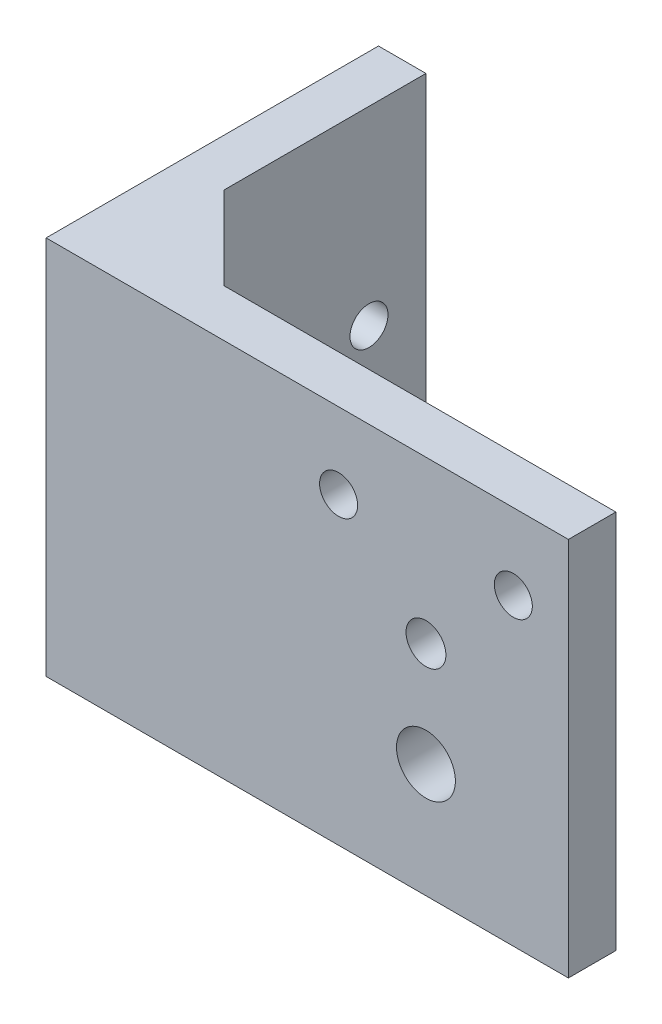
ISO-10303-21;
HEADER;
FILE_DESCRIPTION(('STEP AP214'),'2;1');
FILE_NAME('part.step','',(''),(''),'','','');
FILE_SCHEMA(('AUTOMOTIVE_DESIGN { 1 0 10303 214 1 1 1 1 }'));
ENDSEC;
DATA;
#1=APPLICATION_CONTEXT('core data for automotive mechanical design processes');
#2=APPLICATION_PROTOCOL_DEFINITION('international standard','automotive_design',2000,#1);
#3=PRODUCT_CONTEXT('',#1,'mechanical');
#4=PRODUCT('Part','Part','',(#3));
#5=PRODUCT_RELATED_PRODUCT_CATEGORY('part','',(#4));
#6=PRODUCT_DEFINITION_FORMATION('','',#4);
#7=PRODUCT_DEFINITION_CONTEXT('part definition',#1,'design');
#8=PRODUCT_DEFINITION('design','',#6,#7);
#9=PRODUCT_DEFINITION_SHAPE('','',#8);
#10=(LENGTH_UNIT() NAMED_UNIT(*) SI_UNIT(.MILLI.,.METRE.));
#11=(NAMED_UNIT(*) PLANE_ANGLE_UNIT() SI_UNIT($,.RADIAN.));
#12=(NAMED_UNIT(*) SI_UNIT($,.STERADIAN.) SOLID_ANGLE_UNIT());
#13=UNCERTAINTY_MEASURE_WITH_UNIT(LENGTH_MEASURE(1.E-05),#10,'distance_accuracy_value','');
#14=(GEOMETRIC_REPRESENTATION_CONTEXT(3) GLOBAL_UNCERTAINTY_ASSIGNED_CONTEXT((#13)) GLOBAL_UNIT_ASSIGNED_CONTEXT((#10,
#11,#12)) REPRESENTATION_CONTEXT('',''));
#15=CARTESIAN_POINT('',(0.,0.,0.));
#16=DIRECTION('',(0.,0.,1.));
#17=DIRECTION('',(1.,0.,0.));
#18=AXIS2_PLACEMENT_3D('',#15,#16,#17);
#19=CARTESIAN_POINT('',(5.,40.,-35.));
#20=DIRECTION('',(1.,0.,0.));
#21=DIRECTION('',(0.,0.,-1.));
#22=AXIS2_PLACEMENT_3D('',#19,#20,#21);
#23=PLANE('',#22);
#24=CARTESIAN_POINT('',(5.,31.,-11.));
#25=DIRECTION('',(1.,0.,0.));
#26=DIRECTION('',(0.,0.,-1.));
#27=AXIS2_PLACEMENT_3D('',#24,#25,#26);
#28=CIRCLE('',#27,2.);
#29=CARTESIAN_POINT('',(5.,31.,-13.));
#30=VERTEX_POINT('',#29);
#31=EDGE_CURVE('E481',#30,#30,#28,.T.);
#32=ORIENTED_EDGE('',*,*,#31,.F.);
#33=EDGE_LOOP('',(#32));
#34=FACE_BOUND('',#33,.T.);
#35=CARTESIAN_POINT('',(5.,8.99999999999999,-11.));
#36=DIRECTION('',(1.,0.,0.));
#37=DIRECTION('',(0.,0.,-1.));
#38=AXIS2_PLACEMENT_3D('',#35,#36,#37);
#39=CIRCLE('',#38,2.);
#40=CARTESIAN_POINT('',(5.,8.99999999999999,-13.));
#41=VERTEX_POINT('',#40);
#42=EDGE_CURVE('E473',#41,#41,#39,.T.);
#43=ORIENTED_EDGE('',*,*,#42,.F.);
#44=EDGE_LOOP('',(#43));
#45=FACE_BOUND('',#44,.T.);
#46=CARTESIAN_POINT('',(5.,20.,-29.));
#47=DIRECTION('',(1.,0.,0.));
#48=DIRECTION('',(0.,0.,-1.));
#49=AXIS2_PLACEMENT_3D('',#46,#47,#48);
#50=CIRCLE('',#49,2.);
#51=CARTESIAN_POINT('',(5.,20.,-31.));
#52=VERTEX_POINT('',#51);
#53=EDGE_CURVE('E465',#52,#52,#50,.T.);
#54=ORIENTED_EDGE('',*,*,#53,.F.);
#55=EDGE_LOOP('',(#54));
#56=FACE_BOUND('',#55,.T.);
#57=DIRECTION('',(0.,0.,1.));
#58=VECTOR('',#57,1.);
#59=CARTESIAN_POINT('',(5.,5.,-13.7500000000001));
#60=LINE('',#59,#58);
#61=CARTESIAN_POINT('',(5.,5.,-13.7500000000001));
#62=VERTEX_POINT('',#61);
#63=CARTESIAN_POINT('',(5.,5.,-5.));
#64=VERTEX_POINT('',#63);
#65=EDGE_CURVE('E195',#62,#64,#60,.T.);
#66=ORIENTED_EDGE('',*,*,#65,.F.);
#67=DIRECTION('',(0.,-1.,0.));
#68=VECTOR('',#67,1.);
#69=CARTESIAN_POINT('',(5.,5.,-13.7500000000001));
#70=LINE('',#69,#68);
#71=CARTESIAN_POINT('',(5.,0.,-13.7500000000001));
#72=VERTEX_POINT('',#71);
#73=EDGE_CURVE('E424',#62,#72,#70,.T.);
#74=ORIENTED_EDGE('',*,*,#73,.T.);
#75=DIRECTION('',(0.,0.,1.));
#76=VECTOR('',#75,1.);
#77=CARTESIAN_POINT('',(5.,0.,-35.));
#78=LINE('',#77,#76);
#79=CARTESIAN_POINT('',(5.,0.,-35.));
#80=VERTEX_POINT('',#79);
#81=EDGE_CURVE('E157',#80,#72,#78,.T.);
#82=ORIENTED_EDGE('',*,*,#81,.F.);
#83=DIRECTION('',(0.,-1.,0.));
#84=VECTOR('',#83,1.);
#85=CARTESIAN_POINT('',(5.,40.,-35.));
#86=LINE('',#85,#84);
#87=CARTESIAN_POINT('',(5.,40.,-35.));
#88=VERTEX_POINT('',#87);
#89=EDGE_CURVE('E49',#88,#80,#86,.T.);
#90=ORIENTED_EDGE('',*,*,#89,.F.);
#91=DIRECTION('',(0.,0.,1.));
#92=VECTOR('',#91,1.);
#93=CARTESIAN_POINT('',(5.,40.,-35.));
#94=LINE('',#93,#92);
#95=CARTESIAN_POINT('',(5.,40.,-13.7500000000001));
#96=VERTEX_POINT('',#95);
#97=EDGE_CURVE('E116',#88,#96,#94,.T.);
#98=ORIENTED_EDGE('',*,*,#97,.T.);
#99=DIRECTION('',(0.,-1.,0.));
#100=VECTOR('',#99,1.);
#101=CARTESIAN_POINT('',(5.,40.,-13.7500000000001));
#102=LINE('',#101,#100);
#103=CARTESIAN_POINT('',(5.,35.,-13.7500000000001));
#104=VERTEX_POINT('',#103);
#105=EDGE_CURVE('E11',#96,#104,#102,.T.);
#106=ORIENTED_EDGE('',*,*,#105,.T.);
#107=DIRECTION('',(0.,0.,1.));
#108=VECTOR('',#107,1.);
#109=CARTESIAN_POINT('',(5.,35.,-13.7500000000001));
#110=LINE('',#109,#108);
#111=CARTESIAN_POINT('',(5.,35.,-5.));
#112=VERTEX_POINT('',#111);
#113=EDGE_CURVE('E214',#104,#112,#110,.T.);
#114=ORIENTED_EDGE('',*,*,#113,.T.);
#115=DIRECTION('',(0.,-1.,0.));
#116=VECTOR('',#115,1.);
#117=CARTESIAN_POINT('',(5.,35.,-5.));
#118=LINE('',#117,#116);
#119=EDGE_CURVE('E145',#112,#64,#118,.T.);
#120=ORIENTED_EDGE('',*,*,#119,.T.);
#121=EDGE_LOOP('',(#66,#74,#82,#90,#98,#106,#114,#120));
#122=FACE_BOUND('',#121,.T.);
#123=ADVANCED_FACE('F39',(#34,#45,#56,#122),#23,.T.);
#124=CARTESIAN_POINT('',(13.75,40.,-5.));
#125=DIRECTION('',(0.,0.,-1.));
#126=DIRECTION('',(-1.,0.,0.));
#127=AXIS2_PLACEMENT_3D('',#124,#125,#126);
#128=PLANE('',#127);
#129=CARTESIAN_POINT('',(49.2,32.,-5.));
#130=DIRECTION('',(0.,0.,-1.));
#131=DIRECTION('',(-1.,0.,0.));
#132=AXIS2_PLACEMENT_3D('',#129,#130,#131);
#133=CIRCLE('',#132,2.);
#134=CARTESIAN_POINT('',(47.2,32.,-5.));
#135=VERTEX_POINT('',#134);
#136=EDGE_CURVE('E459',#135,#135,#133,.T.);
#137=ORIENTED_EDGE('',*,*,#136,.F.);
#138=EDGE_LOOP('',(#137));
#139=FACE_BOUND('',#138,.T.);
#140=CARTESIAN_POINT('',(40.,12.,-5.));
#141=DIRECTION('',(0.,0.,-1.));
#142=DIRECTION('',(-1.,0.,0.));
#143=AXIS2_PLACEMENT_3D('',#140,#141,#142);
#144=CIRCLE('',#143,3.1);
#145=CARTESIAN_POINT('',(36.9,12.,-5.));
#146=VERTEX_POINT('',#145);
#147=EDGE_CURVE('E451',#146,#146,#144,.T.);
#148=ORIENTED_EDGE('',*,*,#147,.F.);
#149=EDGE_LOOP('',(#148));
#150=FACE_BOUND('',#149,.T.);
#151=CARTESIAN_POINT('',(40.,23.,-5.));
#152=DIRECTION('',(0.,0.,-1.));
#153=DIRECTION('',(-1.,0.,0.));
#154=AXIS2_PLACEMENT_3D('',#151,#152,#153);
#155=CIRCLE('',#154,2.1);
#156=CARTESIAN_POINT('',(37.9,23.,-5.));
#157=VERTEX_POINT('',#156);
#158=EDGE_CURVE('E443',#157,#157,#155,.T.);
#159=ORIENTED_EDGE('',*,*,#158,.F.);
#160=EDGE_LOOP('',(#159));
#161=FACE_BOUND('',#160,.T.);
#162=CARTESIAN_POINT('',(30.8,32.,-5.));
#163=DIRECTION('',(0.,0.,-1.));
#164=DIRECTION('',(-1.,0.,0.));
#165=AXIS2_PLACEMENT_3D('',#162,#163,#164);
#166=CIRCLE('',#165,2.);
#167=CARTESIAN_POINT('',(28.8,32.,-5.));
#168=VERTEX_POINT('',#167);
#169=EDGE_CURVE('E434',#168,#168,#166,.T.);
#170=ORIENTED_EDGE('',*,*,#169,.F.);
#171=EDGE_LOOP('',(#170));
#172=FACE_BOUND('',#171,.T.);
#173=DIRECTION('',(1.,0.,0.));
#174=VECTOR('',#173,1.);
#175=CARTESIAN_POINT('',(13.75,0.,-5.));
#176=LINE('',#175,#174);
#177=CARTESIAN_POINT('',(13.75,0.,-5.));
#178=VERTEX_POINT('',#177);
#179=CARTESIAN_POINT('',(55.,0.,-5.));
#180=VERTEX_POINT('',#179);
#181=EDGE_CURVE('E141',#178,#180,#176,.T.);
#182=ORIENTED_EDGE('',*,*,#181,.F.);
#183=DIRECTION('',(0.,-1.,0.));
#184=VECTOR('',#183,1.);
#185=CARTESIAN_POINT('',(13.75,5.,-5.));
#186=LINE('',#185,#184);
#187=CARTESIAN_POINT('',(13.75,5.,-5.));
#188=VERTEX_POINT('',#187);
#189=EDGE_CURVE('E210',#188,#178,#186,.T.);
#190=ORIENTED_EDGE('',*,*,#189,.F.);
#191=DIRECTION('',(1.,0.,0.));
#192=VECTOR('',#191,1.);
#193=CARTESIAN_POINT('',(5.,5.,-5.));
#194=LINE('',#193,#192);
#195=EDGE_CURVE('E198',#64,#188,#194,.T.);
#196=ORIENTED_EDGE('',*,*,#195,.F.);
#197=ORIENTED_EDGE('',*,*,#119,.F.);
#198=DIRECTION('',(1.,0.,0.));
#199=VECTOR('',#198,1.);
#200=CARTESIAN_POINT('',(5.,35.,-5.));
#201=LINE('',#200,#199);
#202=CARTESIAN_POINT('',(13.75,35.,-5.));
#203=VERTEX_POINT('',#202);
#204=EDGE_CURVE('E419',#112,#203,#201,.T.);
#205=ORIENTED_EDGE('',*,*,#204,.T.);
#206=DIRECTION('',(0.,-1.,0.));
#207=VECTOR('',#206,1.);
#208=CARTESIAN_POINT('',(13.75,40.,-5.));
#209=LINE('',#208,#207);
#210=CARTESIAN_POINT('',(13.75,40.,-5.));
#211=VERTEX_POINT('',#210);
#212=EDGE_CURVE('E43',#211,#203,#209,.T.);
#213=ORIENTED_EDGE('',*,*,#212,.F.);
#214=DIRECTION('',(1.,0.,0.));
#215=VECTOR('',#214,1.);
#216=CARTESIAN_POINT('',(13.75,40.,-5.));
#217=LINE('',#216,#215);
#218=CARTESIAN_POINT('',(55.,40.,-5.));
#219=VERTEX_POINT('',#218);
#220=EDGE_CURVE('E223',#211,#219,#217,.T.);
#221=ORIENTED_EDGE('',*,*,#220,.T.);
#222=DIRECTION('',(0.,-1.,0.));
#223=VECTOR('',#222,1.);
#224=CARTESIAN_POINT('',(55.,40.,-5.));
#225=LINE('',#224,#223);
#226=EDGE_CURVE('E168',#219,#180,#225,.T.);
#227=ORIENTED_EDGE('',*,*,#226,.T.);
#228=EDGE_LOOP('',(#182,#190,#196,#197,#205,#213,#221,#227));
#229=FACE_BOUND('',#228,.T.);
#230=ADVANCED_FACE('F209',(#139,#150,#161,#172,#229),#128,.T.);
#231=CARTESIAN_POINT('',(5.,40.,-13.7500000000001));
#232=DIRECTION('',(0.707106781186553,0.,-0.707106781186542));
#233=DIRECTION('',(-0.707106781186542,0.,-0.707106781186553));
#234=AXIS2_PLACEMENT_3D('',#231,#232,#233);
#235=PLANE('',#234);
#236=ORIENTED_EDGE('',*,*,#212,.T.);
#237=DIRECTION('',(-0.707106781186542,0.,-0.707106781186553));
#238=VECTOR('',#237,1.);
#239=CARTESIAN_POINT('',(13.75,35.,-5.));
#240=LINE('',#239,#238);
#241=EDGE_CURVE('E177',#203,#104,#240,.T.);
#242=ORIENTED_EDGE('',*,*,#241,.T.);
#243=ORIENTED_EDGE('',*,*,#105,.F.);
#244=DIRECTION('',(0.707106781186542,0.,0.707106781186553));
#245=VECTOR('',#244,1.);
#246=CARTESIAN_POINT('',(5.,40.,-13.7500000000001));
#247=LINE('',#246,#245);
#248=EDGE_CURVE('E159',#96,#211,#247,.T.);
#249=ORIENTED_EDGE('',*,*,#248,.T.);
#250=EDGE_LOOP('',(#236,#242,#243,#249));
#251=FACE_BOUND('',#250,.T.);
#252=ADVANCED_FACE('F41',(#251),#235,.T.);
#253=CARTESIAN_POINT('',(0.,0.,0.));
#254=DIRECTION('',(0.,1.,0.));
#255=DIRECTION('',(0.,0.,1.));
#256=AXIS2_PLACEMENT_3D('',#253,#254,#255);
#257=PLANE('',#256);
#258=ORIENTED_EDGE('',*,*,#81,.T.);
#259=DIRECTION('',(-0.707106781186542,0.,-0.707106781186553));
#260=VECTOR('',#259,1.);
#261=CARTESIAN_POINT('',(13.75,0.,-5.));
#262=LINE('',#261,#260);
#263=EDGE_CURVE('E57',#178,#72,#262,.T.);
#264=ORIENTED_EDGE('',*,*,#263,.F.);
#265=ORIENTED_EDGE('',*,*,#181,.T.);
#266=DIRECTION('',(0.,0.,-1.));
#267=VECTOR('',#266,1.);
#268=CARTESIAN_POINT('',(55.,0.,0.));
#269=LINE('',#268,#267);
#270=CARTESIAN_POINT('',(55.,0.,0.));
#271=VERTEX_POINT('',#270);
#272=EDGE_CURVE('E144',#271,#180,#269,.T.);
#273=ORIENTED_EDGE('',*,*,#272,.F.);
#274=DIRECTION('',(1.,0.,0.));
#275=VECTOR('',#274,1.);
#276=CARTESIAN_POINT('',(0.,0.,0.));
#277=LINE('',#276,#275);
#278=CARTESIAN_POINT('',(0.,0.,0.));
#279=VERTEX_POINT('',#278);
#280=EDGE_CURVE('E149',#279,#271,#277,.T.);
#281=ORIENTED_EDGE('',*,*,#280,.F.);
#282=DIRECTION('',(0.,0.,1.));
#283=VECTOR('',#282,1.);
#284=CARTESIAN_POINT('',(0.,0.,-35.));
#285=LINE('',#284,#283);
#286=CARTESIAN_POINT('',(0.,0.,-35.));
#287=VERTEX_POINT('',#286);
#288=EDGE_CURVE('E152',#287,#279,#285,.T.);
#289=ORIENTED_EDGE('',*,*,#288,.F.);
#290=DIRECTION('',(-1.,0.,0.));
#291=VECTOR('',#290,1.);
#292=CARTESIAN_POINT('',(5.,0.,-35.));
#293=LINE('',#292,#291);
#294=EDGE_CURVE('E122',#80,#287,#293,.T.);
#295=ORIENTED_EDGE('',*,*,#294,.F.);
#296=EDGE_LOOP('',(#258,#264,#265,#273,#281,#289,#295));
#297=FACE_BOUND('',#296,.T.);
#298=ADVANCED_FACE('F232',(#297),#257,.F.);
#299=CARTESIAN_POINT('',(5.,40.,-35.));
#300=DIRECTION('',(0.,0.,1.));
#301=DIRECTION('',(1.,0.,0.));
#302=AXIS2_PLACEMENT_3D('',#299,#300,#301);
#303=PLANE('',#302);
#304=ORIENTED_EDGE('',*,*,#294,.T.);
#305=DIRECTION('',(0.,-1.,0.));
#306=VECTOR('',#305,1.);
#307=CARTESIAN_POINT('',(0.,40.,-35.));
#308=LINE('',#307,#306);
#309=CARTESIAN_POINT('',(0.,40.,-35.));
#310=VERTEX_POINT('',#309);
#311=EDGE_CURVE('E120',#310,#287,#308,.T.);
#312=ORIENTED_EDGE('',*,*,#311,.F.);
#313=DIRECTION('',(-1.,0.,0.));
#314=VECTOR('',#313,1.);
#315=CARTESIAN_POINT('',(5.,40.,-35.));
#316=LINE('',#315,#314);
#317=EDGE_CURVE('E109',#88,#310,#316,.T.);
#318=ORIENTED_EDGE('',*,*,#317,.F.);
#319=ORIENTED_EDGE('',*,*,#89,.T.);
#320=EDGE_LOOP('',(#304,#312,#318,#319));
#321=FACE_BOUND('',#320,.T.);
#322=ADVANCED_FACE('F121',(#321),#303,.F.);
#323=CARTESIAN_POINT('',(0.,40.,-35.));
#324=DIRECTION('',(1.,0.,0.));
#325=DIRECTION('',(0.,0.,-1.));
#326=AXIS2_PLACEMENT_3D('',#323,#324,#325);
#327=PLANE('',#326);
#328=CARTESIAN_POINT('',(0.,31.,-11.));
#329=DIRECTION('',(1.,0.,0.));
#330=DIRECTION('',(0.,0.,-1.));
#331=AXIS2_PLACEMENT_3D('',#328,#329,#330);
#332=CIRCLE('',#331,2.);
#333=CARTESIAN_POINT('',(0.,31.,-13.));
#334=VERTEX_POINT('',#333);
#335=EDGE_CURVE('E439',#334,#334,#332,.T.);
#336=ORIENTED_EDGE('',*,*,#335,.T.);
#337=EDGE_LOOP('',(#336));
#338=FACE_BOUND('',#337,.T.);
#339=CARTESIAN_POINT('',(0.,8.99999999999999,-11.));
#340=DIRECTION('',(1.,0.,0.));
#341=DIRECTION('',(0.,0.,-1.));
#342=AXIS2_PLACEMENT_3D('',#339,#340,#341);
#343=CIRCLE('',#342,2.);
#344=CARTESIAN_POINT('',(0.,8.99999999999999,-13.));
#345=VERTEX_POINT('',#344);
#346=EDGE_CURVE('E477',#345,#345,#343,.T.);
#347=ORIENTED_EDGE('',*,*,#346,.T.);
#348=EDGE_LOOP('',(#347));
#349=FACE_BOUND('',#348,.T.);
#350=CARTESIAN_POINT('',(0.,20.,-29.));
#351=DIRECTION('',(1.,0.,0.));
#352=DIRECTION('',(0.,0.,-1.));
#353=AXIS2_PLACEMENT_3D('',#350,#351,#352);
#354=CIRCLE('',#353,2.);
#355=CARTESIAN_POINT('',(0.,20.,-31.));
#356=VERTEX_POINT('',#355);
#357=EDGE_CURVE('E469',#356,#356,#354,.T.);
#358=ORIENTED_EDGE('',*,*,#357,.T.);
#359=EDGE_LOOP('',(#358));
#360=FACE_BOUND('',#359,.T.);
#361=ORIENTED_EDGE('',*,*,#288,.T.);
#362=DIRECTION('',(0.,-1.,0.));
#363=VECTOR('',#362,1.);
#364=CARTESIAN_POINT('',(0.,40.,0.));
#365=LINE('',#364,#363);
#366=CARTESIAN_POINT('',(0.,40.,0.));
#367=VERTEX_POINT('',#366);
#368=EDGE_CURVE('E126',#367,#279,#365,.T.);
#369=ORIENTED_EDGE('',*,*,#368,.F.);
#370=DIRECTION('',(0.,0.,1.));
#371=VECTOR('',#370,1.);
#372=CARTESIAN_POINT('',(0.,40.,-35.));
#373=LINE('',#372,#371);
#374=EDGE_CURVE('E113',#310,#367,#373,.T.);
#375=ORIENTED_EDGE('',*,*,#374,.F.);
#376=ORIENTED_EDGE('',*,*,#311,.T.);
#377=EDGE_LOOP('',(#361,#369,#375,#376));
#378=FACE_BOUND('',#377,.T.);
#379=ADVANCED_FACE('F128',(#338,#349,#360,#378),#327,.F.);
#380=CARTESIAN_POINT('',(0.,40.,0.));
#381=DIRECTION('',(0.,0.,-1.));
#382=DIRECTION('',(-1.,0.,0.));
#383=AXIS2_PLACEMENT_3D('',#380,#381,#382);
#384=PLANE('',#383);
#385=CARTESIAN_POINT('',(49.2,32.,0.));
#386=DIRECTION('',(0.,0.,-1.));
#387=DIRECTION('',(-1.,0.,0.));
#388=AXIS2_PLACEMENT_3D('',#385,#386,#387);
#389=CIRCLE('',#388,2.);
#390=CARTESIAN_POINT('',(47.2,32.,0.));
#391=VERTEX_POINT('',#390);
#392=EDGE_CURVE('E431',#391,#391,#389,.T.);
#393=ORIENTED_EDGE('',*,*,#392,.T.);
#394=EDGE_LOOP('',(#393));
#395=FACE_BOUND('',#394,.T.);
#396=CARTESIAN_POINT('',(40.,12.,0.));
#397=DIRECTION('',(0.,0.,-1.));
#398=DIRECTION('',(-1.,0.,0.));
#399=AXIS2_PLACEMENT_3D('',#396,#397,#398);
#400=CIRCLE('',#399,3.1);
#401=CARTESIAN_POINT('',(36.9,12.,0.));
#402=VERTEX_POINT('',#401);
#403=EDGE_CURVE('E455',#402,#402,#400,.T.);
#404=ORIENTED_EDGE('',*,*,#403,.T.);
#405=EDGE_LOOP('',(#404));
#406=FACE_BOUND('',#405,.T.);
#407=CARTESIAN_POINT('',(40.,23.,0.));
#408=DIRECTION('',(0.,0.,-1.));
#409=DIRECTION('',(-1.,0.,0.));
#410=AXIS2_PLACEMENT_3D('',#407,#408,#409);
#411=CIRCLE('',#410,2.1);
#412=CARTESIAN_POINT('',(37.9,23.,0.));
#413=VERTEX_POINT('',#412);
#414=EDGE_CURVE('E447',#413,#413,#411,.T.);
#415=ORIENTED_EDGE('',*,*,#414,.T.);
#416=EDGE_LOOP('',(#415));
#417=FACE_BOUND('',#416,.T.);
#418=CARTESIAN_POINT('',(30.8,32.,0.));
#419=DIRECTION('',(0.,0.,-1.));
#420=DIRECTION('',(-1.,0.,0.));
#421=AXIS2_PLACEMENT_3D('',#418,#419,#420);
#422=CIRCLE('',#421,2.);
#423=CARTESIAN_POINT('',(28.8,32.,0.));
#424=VERTEX_POINT('',#423);
#425=EDGE_CURVE('E438',#424,#424,#422,.T.);
#426=ORIENTED_EDGE('',*,*,#425,.T.);
#427=EDGE_LOOP('',(#426));
#428=FACE_BOUND('',#427,.T.);
#429=ORIENTED_EDGE('',*,*,#280,.T.);
#430=DIRECTION('',(0.,-1.,0.));
#431=VECTOR('',#430,1.);
#432=CARTESIAN_POINT('',(55.,40.,0.));
#433=LINE('',#432,#431);
#434=CARTESIAN_POINT('',(55.,40.,0.));
#435=VERTEX_POINT('',#434);
#436=EDGE_CURVE('E165',#435,#271,#433,.T.);
#437=ORIENTED_EDGE('',*,*,#436,.F.);
#438=DIRECTION('',(1.,0.,0.));
#439=VECTOR('',#438,1.);
#440=CARTESIAN_POINT('',(0.,40.,0.));
#441=LINE('',#440,#439);
#442=EDGE_CURVE('E132',#367,#435,#441,.T.);
#443=ORIENTED_EDGE('',*,*,#442,.F.);
#444=ORIENTED_EDGE('',*,*,#368,.T.);
#445=EDGE_LOOP('',(#429,#437,#443,#444));
#446=FACE_BOUND('',#445,.T.);
#447=ADVANCED_FACE('F234',(#395,#406,#417,#428,#446),#384,.F.);
#448=CARTESIAN_POINT('',(55.,40.,0.));
#449=DIRECTION('',(-1.,0.,0.));
#450=DIRECTION('',(0.,0.,1.));
#451=AXIS2_PLACEMENT_3D('',#448,#449,#450);
#452=PLANE('',#451);
#453=ORIENTED_EDGE('',*,*,#272,.T.);
#454=ORIENTED_EDGE('',*,*,#226,.F.);
#455=DIRECTION('',(0.,0.,-1.));
#456=VECTOR('',#455,1.);
#457=CARTESIAN_POINT('',(55.,40.,0.));
#458=LINE('',#457,#456);
#459=EDGE_CURVE('E135',#435,#219,#458,.T.);
#460=ORIENTED_EDGE('',*,*,#459,.F.);
#461=ORIENTED_EDGE('',*,*,#436,.T.);
#462=EDGE_LOOP('',(#453,#454,#460,#461));
#463=FACE_BOUND('',#462,.T.);
#464=ADVANCED_FACE('F229',(#463),#452,.F.);
#465=CARTESIAN_POINT('',(0.,40.,0.));
#466=DIRECTION('',(0.,1.,0.));
#467=DIRECTION('',(0.,0.,1.));
#468=AXIS2_PLACEMENT_3D('',#465,#466,#467);
#469=PLANE('',#468);
#470=ORIENTED_EDGE('',*,*,#248,.F.);
#471=ORIENTED_EDGE('',*,*,#97,.F.);
#472=ORIENTED_EDGE('',*,*,#317,.T.);
#473=ORIENTED_EDGE('',*,*,#374,.T.);
#474=ORIENTED_EDGE('',*,*,#442,.T.);
#475=ORIENTED_EDGE('',*,*,#459,.T.);
#476=ORIENTED_EDGE('',*,*,#220,.F.);
#477=EDGE_LOOP('',(#470,#471,#472,#473,#474,#475,#476));
#478=FACE_BOUND('',#477,.T.);
#479=ADVANCED_FACE('F111',(#478),#469,.T.);
#480=CARTESIAN_POINT('',(0.,35.,0.));
#481=DIRECTION('',(0.,-1.,0.));
#482=DIRECTION('',(0.,0.,-1.));
#483=AXIS2_PLACEMENT_3D('',#480,#481,#482);
#484=PLANE('',#483);
#485=ORIENTED_EDGE('',*,*,#204,.F.);
#486=ORIENTED_EDGE('',*,*,#113,.F.);
#487=ORIENTED_EDGE('',*,*,#241,.F.);
#488=EDGE_LOOP('',(#485,#486,#487));
#489=FACE_BOUND('',#488,.T.);
#490=ADVANCED_FACE('F379',(#489),#484,.T.);
#491=CARTESIAN_POINT('',(13.75,5.,-5.));
#492=DIRECTION('',(-0.707106781186553,0.,0.707106781186542));
#493=DIRECTION('',(0.707106781186542,0.,0.707106781186553));
#494=AXIS2_PLACEMENT_3D('',#491,#492,#493);
#495=PLANE('',#494);
#496=ORIENTED_EDGE('',*,*,#263,.T.);
#497=ORIENTED_EDGE('',*,*,#73,.F.);
#498=DIRECTION('',(-0.707106781186542,0.,-0.707106781186553));
#499=VECTOR('',#498,1.);
#500=CARTESIAN_POINT('',(13.75,5.,-5.));
#501=LINE('',#500,#499);
#502=EDGE_CURVE('E200',#188,#62,#501,.T.);
#503=ORIENTED_EDGE('',*,*,#502,.F.);
#504=ORIENTED_EDGE('',*,*,#189,.T.);
#505=EDGE_LOOP('',(#496,#497,#503,#504));
#506=FACE_BOUND('',#505,.T.);
#507=ADVANCED_FACE('F376',(#506),#495,.F.);
#508=CARTESIAN_POINT('',(0.,5.,0.));
#509=DIRECTION('',(0.,1.,0.));
#510=DIRECTION('',(0.,0.,1.));
#511=AXIS2_PLACEMENT_3D('',#508,#509,#510);
#512=PLANE('',#511);
#513=ORIENTED_EDGE('',*,*,#65,.T.);
#514=ORIENTED_EDGE('',*,*,#195,.T.);
#515=ORIENTED_EDGE('',*,*,#502,.T.);
#516=EDGE_LOOP('',(#513,#514,#515));
#517=FACE_BOUND('',#516,.T.);
#518=ADVANCED_FACE('F197',(#517),#512,.T.);
#519=CARTESIAN_POINT('',(30.8,32.,0.));
#520=DIRECTION('',(0.,0.,-1.));
#521=DIRECTION('',(-1.,0.,0.));
#522=AXIS2_PLACEMENT_3D('',#519,#520,#521);
#523=CYLINDRICAL_SURFACE('',#522,2.);
#524=ORIENTED_EDGE('',*,*,#425,.F.);
#525=EDGE_LOOP('',(#524));
#526=FACE_BOUND('',#525,.T.);
#527=ORIENTED_EDGE('',*,*,#169,.T.);
#528=EDGE_LOOP('',(#527));
#529=FACE_BOUND('',#528,.T.);
#530=ADVANCED_FACE('F292',(#526,#529),#523,.F.);
#531=CARTESIAN_POINT('',(40.,23.,0.));
#532=DIRECTION('',(0.,0.,-1.));
#533=DIRECTION('',(-1.,0.,0.));
#534=AXIS2_PLACEMENT_3D('',#531,#532,#533);
#535=CYLINDRICAL_SURFACE('',#534,2.1);
#536=ORIENTED_EDGE('',*,*,#414,.F.);
#537=EDGE_LOOP('',(#536));
#538=FACE_BOUND('',#537,.T.);
#539=ORIENTED_EDGE('',*,*,#158,.T.);
#540=EDGE_LOOP('',(#539));
#541=FACE_BOUND('',#540,.T.);
#542=ADVANCED_FACE('F297',(#538,#541),#535,.F.);
#543=CARTESIAN_POINT('',(40.,12.,0.));
#544=DIRECTION('',(0.,0.,-1.));
#545=DIRECTION('',(-1.,0.,0.));
#546=AXIS2_PLACEMENT_3D('',#543,#544,#545);
#547=CYLINDRICAL_SURFACE('',#546,3.1);
#548=ORIENTED_EDGE('',*,*,#403,.F.);
#549=EDGE_LOOP('',(#548));
#550=FACE_BOUND('',#549,.T.);
#551=ORIENTED_EDGE('',*,*,#147,.T.);
#552=EDGE_LOOP('',(#551));
#553=FACE_BOUND('',#552,.T.);
#554=ADVANCED_FACE('F307',(#550,#553),#547,.F.);
#555=CARTESIAN_POINT('',(49.2,32.,0.));
#556=DIRECTION('',(0.,0.,-1.));
#557=DIRECTION('',(-1.,0.,0.));
#558=AXIS2_PLACEMENT_3D('',#555,#556,#557);
#559=CYLINDRICAL_SURFACE('',#558,2.);
#560=ORIENTED_EDGE('',*,*,#392,.F.);
#561=EDGE_LOOP('',(#560));
#562=FACE_BOUND('',#561,.T.);
#563=ORIENTED_EDGE('',*,*,#136,.T.);
#564=EDGE_LOOP('',(#563));
#565=FACE_BOUND('',#564,.T.);
#566=ADVANCED_FACE('F317',(#562,#565),#559,.F.);
#567=CARTESIAN_POINT('',(0.,20.,-29.));
#568=DIRECTION('',(1.,0.,0.));
#569=DIRECTION('',(0.,0.,-1.));
#570=AXIS2_PLACEMENT_3D('',#567,#568,#569);
#571=CYLINDRICAL_SURFACE('',#570,2.);
#572=ORIENTED_EDGE('',*,*,#357,.F.);
#573=EDGE_LOOP('',(#572));
#574=FACE_BOUND('',#573,.T.);
#575=ORIENTED_EDGE('',*,*,#53,.T.);
#576=EDGE_LOOP('',(#575));
#577=FACE_BOUND('',#576,.T.);
#578=ADVANCED_FACE('F326',(#574,#577),#571,.F.);
#579=CARTESIAN_POINT('',(0.,8.99999999999999,-11.));
#580=DIRECTION('',(1.,0.,0.));
#581=DIRECTION('',(0.,0.,-1.));
#582=AXIS2_PLACEMENT_3D('',#579,#580,#581);
#583=CYLINDRICAL_SURFACE('',#582,2.);
#584=ORIENTED_EDGE('',*,*,#346,.F.);
#585=EDGE_LOOP('',(#584));
#586=FACE_BOUND('',#585,.T.);
#587=ORIENTED_EDGE('',*,*,#42,.T.);
#588=EDGE_LOOP('',(#587));
#589=FACE_BOUND('',#588,.T.);
#590=ADVANCED_FACE('F348',(#586,#589),#583,.F.);
#591=CARTESIAN_POINT('',(0.,31.,-11.));
#592=DIRECTION('',(1.,0.,0.));
#593=DIRECTION('',(0.,0.,-1.));
#594=AXIS2_PLACEMENT_3D('',#591,#592,#593);
#595=CYLINDRICAL_SURFACE('',#594,2.);
#596=ORIENTED_EDGE('',*,*,#335,.F.);
#597=EDGE_LOOP('',(#596));
#598=FACE_BOUND('',#597,.T.);
#599=ORIENTED_EDGE('',*,*,#31,.T.);
#600=EDGE_LOOP('',(#599));
#601=FACE_BOUND('',#600,.T.);
#602=ADVANCED_FACE('F358',(#598,#601),#595,.F.);
#603=CLOSED_SHELL('',(#123,#230,#252,#298,#322,#379,#447,#464,#479,#490,#507,#518,#530,#542,
#554,#566,#578,#590,#602));
#604=MANIFOLD_SOLID_BREP('B2',#603);
#605=ADVANCED_BREP_SHAPE_REPRESENTATION('',(#18,#604),#14);
#606=SHAPE_DEFINITION_REPRESENTATION(#9,#605);
ENDSEC;
END-ISO-10303-21;
